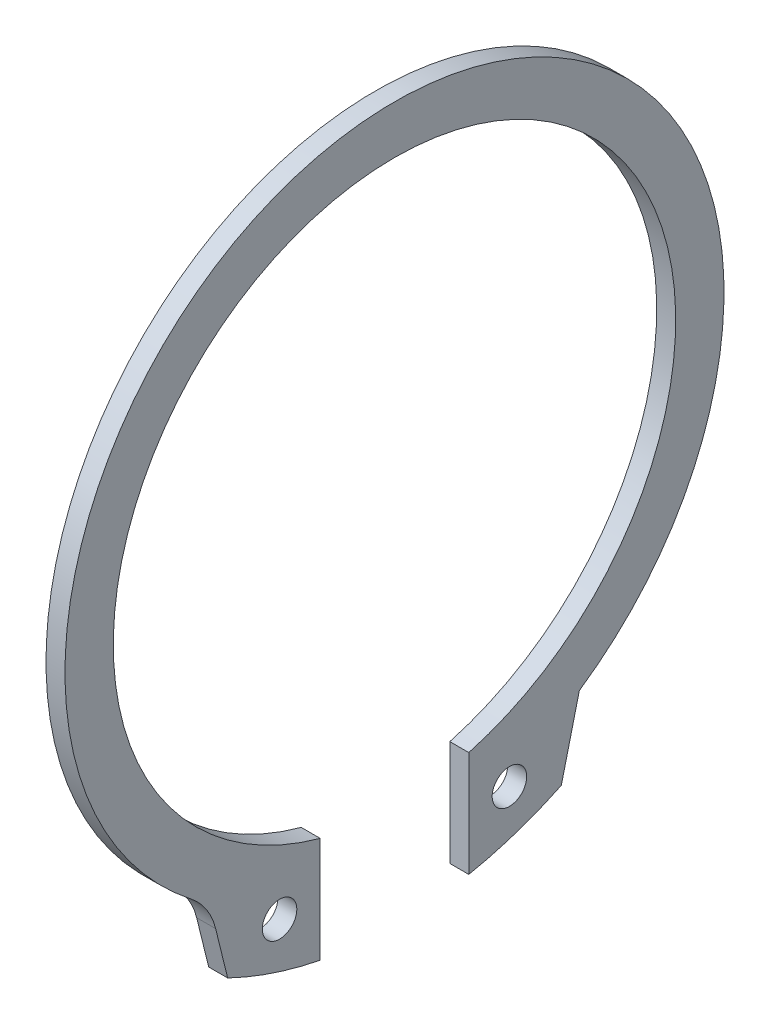
ISO-10303-21;
HEADER;
FILE_DESCRIPTION(('STEP AP214'),'2;1');
FILE_NAME('part.step','',(''),(''),'','','');
FILE_SCHEMA(('AUTOMOTIVE_DESIGN { 1 0 10303 214 1 1 1 1 }'));
ENDSEC;
DATA;
#1=APPLICATION_CONTEXT('core data for automotive mechanical design processes');
#2=APPLICATION_PROTOCOL_DEFINITION('international standard','automotive_design',2000,#1);
#3=PRODUCT_CONTEXT('',#1,'mechanical');
#4=PRODUCT('Part','Part','',(#3));
#5=PRODUCT_RELATED_PRODUCT_CATEGORY('part','',(#4));
#6=PRODUCT_DEFINITION_FORMATION('','',#4);
#7=PRODUCT_DEFINITION_CONTEXT('part definition',#1,'design');
#8=PRODUCT_DEFINITION('design','',#6,#7);
#9=PRODUCT_DEFINITION_SHAPE('','',#8);
#10=(LENGTH_UNIT() NAMED_UNIT(*) SI_UNIT(.MILLI.,.METRE.));
#11=(NAMED_UNIT(*) PLANE_ANGLE_UNIT() SI_UNIT($,.RADIAN.));
#12=(NAMED_UNIT(*) SI_UNIT($,.STERADIAN.) SOLID_ANGLE_UNIT());
#13=UNCERTAINTY_MEASURE_WITH_UNIT(LENGTH_MEASURE(1.E-05),#10,'distance_accuracy_value','');
#14=(GEOMETRIC_REPRESENTATION_CONTEXT(3) GLOBAL_UNCERTAINTY_ASSIGNED_CONTEXT((#13)) GLOBAL_UNIT_ASSIGNED_CONTEXT((#10,
#11,#12)) REPRESENTATION_CONTEXT('',''));
#15=CARTESIAN_POINT('',(0.,0.,0.));
#16=DIRECTION('',(0.,0.,1.));
#17=DIRECTION('',(1.,0.,0.));
#18=AXIS2_PLACEMENT_3D('',#15,#16,#17);
#19=CARTESIAN_POINT('',(2.75,-45.4519677145111,35.6255684990295));
#20=DIRECTION('',(-1.,0.,0.));
#21=DIRECTION('',(0.,0.,1.));
#22=AXIS2_PLACEMENT_3D('',#19,#20,#21);
#23=CYLINDRICAL_SURFACE('',#22,10.);
#24=CARTESIAN_POINT('',(0.,-45.4519677145111,35.6255684990295));
#25=DIRECTION('',(1.,0.,0.));
#26=DIRECTION('',(0.,0.,-1.));
#27=AXIS2_PLACEMENT_3D('',#24,#25,#26);
#28=CIRCLE('',#27,10.);
#29=CARTESIAN_POINT('',(0.,-43.0571234239449,25.916566448152));
#30=VERTEX_POINT('',#29);
#31=CARTESIAN_POINT('',(0.,-37.5814971145957,29.456638888808));
#32=VERTEX_POINT('',#31);
#33=EDGE_CURVE('E146',#30,#32,#28,.T.);
#34=ORIENTED_EDGE('',*,*,#33,.F.);
#35=DIRECTION('',(-1.,0.,0.));
#36=VECTOR('',#35,1.);
#37=CARTESIAN_POINT('',(2.75,-43.0571234239449,25.916566448152));
#38=LINE('',#37,#36);
#39=CARTESIAN_POINT('',(2.75,-43.0571234239449,25.916566448152));
#40=VERTEX_POINT('',#39);
#41=EDGE_CURVE('E11',#40,#30,#38,.T.);
#42=ORIENTED_EDGE('',*,*,#41,.F.);
#43=CARTESIAN_POINT('',(2.75,-45.4519677145111,35.6255684990295));
#44=DIRECTION('',(1.,0.,0.));
#45=DIRECTION('',(0.,0.,-1.));
#46=AXIS2_PLACEMENT_3D('',#43,#44,#45);
#47=CIRCLE('',#46,10.);
#48=CARTESIAN_POINT('',(2.75,-37.5814971145957,29.456638888808));
#49=VERTEX_POINT('',#48);
#50=EDGE_CURVE('E174',#40,#49,#47,.T.);
#51=ORIENTED_EDGE('',*,*,#50,.T.);
#52=DIRECTION('',(-1.,0.,0.));
#53=VECTOR('',#52,1.);
#54=CARTESIAN_POINT('',(2.75,-37.5814971145957,29.456638888808));
#55=LINE('',#54,#53);
#56=EDGE_CURVE('E92',#49,#32,#55,.T.);
#57=ORIENTED_EDGE('',*,*,#56,.T.);
#58=EDGE_LOOP('',(#34,#42,#51,#57));
#59=FACE_BOUND('',#58,.T.);
#60=ADVANCED_FACE('F39',(#59),#23,.F.);
#61=CARTESIAN_POINT('',(2.75,-8.4954491545256,34.4416267852282));
#62=DIRECTION('',(0.,-0.239484429056616,0.970900205087746));
#63=DIRECTION('',(0.,-0.970900205087746,-0.239484429056616));
#64=AXIS2_PLACEMENT_3D('',#61,#62,#63);
#65=PLANE('',#64);
#66=DIRECTION('',(0.,0.970900205087746,0.239484429056616));
#67=VECTOR('',#66,1.);
#68=CARTESIAN_POINT('',(0.,-8.4954491545256,34.4416267852282));
#69=LINE('',#68,#67);
#70=CARTESIAN_POINT('',(0.,-50.1229604559461,24.1736911881113));
#71=VERTEX_POINT('',#70);
#72=EDGE_CURVE('E149',#71,#30,#69,.T.);
#73=ORIENTED_EDGE('',*,*,#72,.F.);
#74=DIRECTION('',(-1.,0.,0.));
#75=VECTOR('',#74,1.);
#76=CARTESIAN_POINT('',(2.75,-50.1229604559461,24.1736911881113));
#77=LINE('',#76,#75);
#78=CARTESIAN_POINT('',(2.75,-50.1229604559461,24.1736911881113));
#79=VERTEX_POINT('',#78);
#80=EDGE_CURVE('E47',#79,#71,#77,.T.);
#81=ORIENTED_EDGE('',*,*,#80,.F.);
#82=DIRECTION('',(0.,0.970900205087746,0.239484429056616));
#83=VECTOR('',#82,1.);
#84=CARTESIAN_POINT('',(2.75,-8.4954491545256,34.4416267852282));
#85=LINE('',#84,#83);
#86=EDGE_CURVE('E198',#79,#40,#85,.T.);
#87=ORIENTED_EDGE('',*,*,#86,.T.);
#88=ORIENTED_EDGE('',*,*,#41,.T.);
#89=EDGE_LOOP('',(#73,#81,#87,#88));
#90=FACE_BOUND('',#89,.T.);
#91=ADVANCED_FACE('F197',(#90),#65,.T.);
#92=CARTESIAN_POINT('',(2.75,0.,0.));
#93=DIRECTION('',(-1.,0.,0.));
#94=DIRECTION('',(0.,0.,1.));
#95=AXIS2_PLACEMENT_3D('',#92,#93,#94);
#96=CYLINDRICAL_SURFACE('',#95,55.647807778263);
#97=CARTESIAN_POINT('',(0.,0.,0.));
#98=DIRECTION('',(1.,0.,0.));
#99=DIRECTION('',(0.,0.,-1.));
#100=AXIS2_PLACEMENT_3D('',#97,#98,#99);
#101=CIRCLE('',#100,55.647807778263);
#102=CARTESIAN_POINT('',(0.,-54.5963916751325,10.7662679969443));
#103=VERTEX_POINT('',#102);
#104=EDGE_CURVE('E152',#71,#103,#101,.T.);
#105=ORIENTED_EDGE('',*,*,#104,.T.);
#106=DIRECTION('',(-1.,0.,0.));
#107=VECTOR('',#106,1.);
#108=CARTESIAN_POINT('',(2.75,-54.5963916751325,10.7662679969443));
#109=LINE('',#108,#107);
#110=CARTESIAN_POINT('',(2.75,-54.5963916751325,10.7662679969443));
#111=VERTEX_POINT('',#110);
#112=EDGE_CURVE('E182',#111,#103,#109,.T.);
#113=ORIENTED_EDGE('',*,*,#112,.F.);
#114=CARTESIAN_POINT('',(2.75,0.,0.));
#115=DIRECTION('',(1.,0.,0.));
#116=DIRECTION('',(0.,0.,-1.));
#117=AXIS2_PLACEMENT_3D('',#114,#115,#116);
#118=CIRCLE('',#117,55.647807778263);
#119=EDGE_CURVE('E188',#79,#111,#118,.T.);
#120=ORIENTED_EDGE('',*,*,#119,.F.);
#121=ORIENTED_EDGE('',*,*,#80,.T.);
#122=EDGE_LOOP('',(#105,#113,#120,#121));
#123=FACE_BOUND('',#122,.T.);
#124=ADVANCED_FACE('F186',(#123),#96,.T.);
#125=CARTESIAN_POINT('',(2.75,0.,10.7662679969443));
#126=DIRECTION('',(0.,0.,-1.));
#127=DIRECTION('',(0.,1.,0.));
#128=AXIS2_PLACEMENT_3D('',#125,#126,#127);
#129=PLANE('',#128);
#130=DIRECTION('',(0.,-1.,0.));
#131=VECTOR('',#130,1.);
#132=CARTESIAN_POINT('',(0.,0.,10.7662679969443));
#133=LINE('',#132,#131);
#134=CARTESIAN_POINT('',(0.,-39.3020352325166,10.7662679969443));
#135=VERTEX_POINT('',#134);
#136=EDGE_CURVE('E155',#135,#103,#133,.T.);
#137=ORIENTED_EDGE('',*,*,#136,.F.);
#138=DIRECTION('',(-1.,0.,0.));
#139=VECTOR('',#138,1.);
#140=CARTESIAN_POINT('',(2.75,-39.3020352325166,10.7662679969443));
#141=LINE('',#140,#139);
#142=CARTESIAN_POINT('',(2.75,-39.3020352325166,10.7662679969443));
#143=VERTEX_POINT('',#142);
#144=EDGE_CURVE('E180',#143,#135,#141,.T.);
#145=ORIENTED_EDGE('',*,*,#144,.F.);
#146=DIRECTION('',(0.,-1.,0.));
#147=VECTOR('',#146,1.);
#148=CARTESIAN_POINT('',(2.75,0.,10.7662679969443));
#149=LINE('',#148,#147);
#150=EDGE_CURVE('E206',#143,#111,#149,.T.);
#151=ORIENTED_EDGE('',*,*,#150,.T.);
#152=ORIENTED_EDGE('',*,*,#112,.T.);
#153=EDGE_LOOP('',(#137,#145,#151,#152));
#154=FACE_BOUND('',#153,.T.);
#155=ADVANCED_FACE('F214',(#154),#129,.T.);
#156=CARTESIAN_POINT('',(2.75,0.,0.));
#157=DIRECTION('',(-1.,0.,0.));
#158=DIRECTION('',(0.,0.,1.));
#159=AXIS2_PLACEMENT_3D('',#156,#157,#158);
#160=CYLINDRICAL_SURFACE('',#159,40.75);
#161=CARTESIAN_POINT('',(0.,0.,0.));
#162=DIRECTION('',(1.,0.,0.));
#163=DIRECTION('',(0.,0.,-1.));
#164=AXIS2_PLACEMENT_3D('',#161,#162,#163);
#165=CIRCLE('',#164,40.75);
#166=CARTESIAN_POINT('',(0.,-39.3020352325166,-10.7662679969443));
#167=VERTEX_POINT('',#166);
#168=EDGE_CURVE('E158',#167,#135,#165,.T.);
#169=ORIENTED_EDGE('',*,*,#168,.F.);
#170=DIRECTION('',(-1.,0.,0.));
#171=VECTOR('',#170,1.);
#172=CARTESIAN_POINT('',(2.75,-39.3020352325166,-10.7662679969443));
#173=LINE('',#172,#171);
#174=CARTESIAN_POINT('',(2.75,-39.3020352325166,-10.7662679969443));
#175=VERTEX_POINT('',#174);
#176=EDGE_CURVE('E178',#175,#167,#173,.T.);
#177=ORIENTED_EDGE('',*,*,#176,.F.);
#178=CARTESIAN_POINT('',(2.75,0.,0.));
#179=DIRECTION('',(1.,0.,0.));
#180=DIRECTION('',(0.,0.,-1.));
#181=AXIS2_PLACEMENT_3D('',#178,#179,#180);
#182=CIRCLE('',#181,40.75);
#183=EDGE_CURVE('E135',#175,#143,#182,.T.);
#184=ORIENTED_EDGE('',*,*,#183,.T.);
#185=ORIENTED_EDGE('',*,*,#144,.T.);
#186=EDGE_LOOP('',(#169,#177,#184,#185));
#187=FACE_BOUND('',#186,.T.);
#188=ADVANCED_FACE('F211',(#187),#160,.F.);
#189=CARTESIAN_POINT('',(2.75,0.,-10.7662679969443));
#190=DIRECTION('',(0.,0.,-1.));
#191=DIRECTION('',(0.,1.,0.));
#192=AXIS2_PLACEMENT_3D('',#189,#190,#191);
#193=PLANE('',#192);
#194=DIRECTION('',(0.,-1.,0.));
#195=VECTOR('',#194,1.);
#196=CARTESIAN_POINT('',(0.,0.,-10.7662679969443));
#197=LINE('',#196,#195);
#198=CARTESIAN_POINT('',(0.,-54.5963916751325,-10.7662679969443));
#199=VERTEX_POINT('',#198);
#200=EDGE_CURVE('E161',#167,#199,#197,.T.);
#201=ORIENTED_EDGE('',*,*,#200,.T.);
#202=DIRECTION('',(-1.,0.,0.));
#203=VECTOR('',#202,1.);
#204=CARTESIAN_POINT('',(2.75,-54.5963916751325,-10.7662679969443));
#205=LINE('',#204,#203);
#206=CARTESIAN_POINT('',(2.75,-54.5963916751325,-10.7662679969443));
#207=VERTEX_POINT('',#206);
#208=EDGE_CURVE('E122',#207,#199,#205,.T.);
#209=ORIENTED_EDGE('',*,*,#208,.F.);
#210=DIRECTION('',(0.,-1.,0.));
#211=VECTOR('',#210,1.);
#212=CARTESIAN_POINT('',(2.75,0.,-10.7662679969443));
#213=LINE('',#212,#211);
#214=EDGE_CURVE('E132',#175,#207,#213,.T.);
#215=ORIENTED_EDGE('',*,*,#214,.F.);
#216=ORIENTED_EDGE('',*,*,#176,.T.);
#217=EDGE_LOOP('',(#201,#209,#215,#216));
#218=FACE_BOUND('',#217,.T.);
#219=ADVANCED_FACE('F217',(#218),#193,.F.);
#220=CARTESIAN_POINT('',(2.75,0.,0.));
#221=DIRECTION('',(-1.,0.,0.));
#222=DIRECTION('',(0.,0.,1.));
#223=AXIS2_PLACEMENT_3D('',#220,#221,#222);
#224=CYLINDRICAL_SURFACE('',#223,55.647807778263);
#225=CARTESIAN_POINT('',(0.,0.,0.));
#226=DIRECTION('',(1.,0.,0.));
#227=DIRECTION('',(0.,0.,-1.));
#228=AXIS2_PLACEMENT_3D('',#225,#226,#227);
#229=CIRCLE('',#228,55.647807778263);
#230=CARTESIAN_POINT('',(0.,-50.1229604559461,-24.1736911881113));
#231=VERTEX_POINT('',#230);
#232=EDGE_CURVE('E121',#231,#199,#229,.F.);
#233=ORIENTED_EDGE('',*,*,#232,.F.);
#234=DIRECTION('',(-1.,0.,0.));
#235=VECTOR('',#234,1.);
#236=CARTESIAN_POINT('',(2.75,-50.1229604559461,-24.1736911881113));
#237=LINE('',#236,#235);
#238=CARTESIAN_POINT('',(2.75,-50.1229604559461,-24.1736911881113));
#239=VERTEX_POINT('',#238);
#240=EDGE_CURVE('E115',#239,#231,#237,.T.);
#241=ORIENTED_EDGE('',*,*,#240,.F.);
#242=CARTESIAN_POINT('',(2.75,0.,0.));
#243=DIRECTION('',(1.,0.,0.));
#244=DIRECTION('',(0.,0.,-1.));
#245=AXIS2_PLACEMENT_3D('',#242,#243,#244);
#246=CIRCLE('',#245,55.647807778263);
#247=EDGE_CURVE('E119',#239,#207,#246,.F.);
#248=ORIENTED_EDGE('',*,*,#247,.T.);
#249=ORIENTED_EDGE('',*,*,#208,.T.);
#250=EDGE_LOOP('',(#233,#241,#248,#249));
#251=FACE_BOUND('',#250,.T.);
#252=ADVANCED_FACE('F117',(#251),#224,.T.);
#253=CARTESIAN_POINT('',(2.75,-8.49544915452554,-34.4416267852281));
#254=DIRECTION('',(0.,0.239484429056615,0.970900205087746));
#255=DIRECTION('',(0.,-0.970900205087746,0.239484429056615));
#256=AXIS2_PLACEMENT_3D('',#253,#254,#255);
#257=PLANE('',#256);
#258=DIRECTION('',(0.,0.970900205087746,-0.239484429056615));
#259=VECTOR('',#258,1.);
#260=CARTESIAN_POINT('',(0.,-8.49544915452554,-34.4416267852281));
#261=LINE('',#260,#259);
#262=CARTESIAN_POINT('',(0.,-39.5288004821451,-26.7868705235003));
#263=VERTEX_POINT('',#262);
#264=EDGE_CURVE('E85',#231,#263,#261,.T.);
#265=ORIENTED_EDGE('',*,*,#264,.T.);
#266=DIRECTION('',(-1.,0.,0.));
#267=VECTOR('',#266,1.);
#268=CARTESIAN_POINT('',(2.75,-39.5288004821451,-26.7868705235003));
#269=LINE('',#268,#267);
#270=CARTESIAN_POINT('',(2.75,-39.5288004821451,-26.7868705235003));
#271=VERTEX_POINT('',#270);
#272=EDGE_CURVE('E123',#271,#263,#269,.T.);
#273=ORIENTED_EDGE('',*,*,#272,.F.);
#274=DIRECTION('',(0.,0.970900205087746,-0.239484429056615));
#275=VECTOR('',#274,1.);
#276=CARTESIAN_POINT('',(2.75,-8.49544915452554,-34.4416267852281));
#277=LINE('',#276,#275);
#278=EDGE_CURVE('E125',#239,#271,#277,.T.);
#279=ORIENTED_EDGE('',*,*,#278,.F.);
#280=ORIENTED_EDGE('',*,*,#240,.T.);
#281=EDGE_LOOP('',(#265,#273,#279,#280));
#282=FACE_BOUND('',#281,.T.);
#283=ADVANCED_FACE('F126',(#282),#257,.F.);
#284=CARTESIAN_POINT('',(2.75,-46.5046247805078,16.6535775260698));
#285=DIRECTION('',(-1.,0.,0.));
#286=DIRECTION('',(0.,0.,1.));
#287=AXIS2_PLACEMENT_3D('',#284,#285,#286);
#288=CYLINDRICAL_SURFACE('',#287,2.5);
#289=CARTESIAN_POINT('',(2.75,-46.5046247805078,16.6535775260698));
#290=DIRECTION('',(1.,0.,0.));
#291=DIRECTION('',(0.,0.,-1.));
#292=AXIS2_PLACEMENT_3D('',#289,#290,#291);
#293=CIRCLE('',#292,2.5);
#294=CARTESIAN_POINT('',(2.75,-46.5046247805078,14.1535775260698));
#295=VERTEX_POINT('',#294);
#296=EDGE_CURVE('E140',#295,#295,#293,.T.);
#297=ORIENTED_EDGE('',*,*,#296,.T.);
#298=EDGE_LOOP('',(#297));
#299=FACE_BOUND('',#298,.T.);
#300=CARTESIAN_POINT('',(0.,-46.5046247805078,16.6535775260698));
#301=DIRECTION('',(1.,0.,0.));
#302=DIRECTION('',(0.,0.,-1.));
#303=AXIS2_PLACEMENT_3D('',#300,#301,#302);
#304=CIRCLE('',#303,2.5);
#305=CARTESIAN_POINT('',(0.,-46.5046247805078,14.1535775260698));
#306=VERTEX_POINT('',#305);
#307=EDGE_CURVE('E168',#306,#306,#304,.T.);
#308=ORIENTED_EDGE('',*,*,#307,.F.);
#309=EDGE_LOOP('',(#308));
#310=FACE_BOUND('',#309,.T.);
#311=ADVANCED_FACE('F263',(#299,#310),#288,.F.);
#312=CARTESIAN_POINT('',(2.75,0.,0.));
#313=DIRECTION('',(-1.,0.,0.));
#314=DIRECTION('',(0.,0.,1.));
#315=AXIS2_PLACEMENT_3D('',#312,#313,#314);
#316=CYLINDRICAL_SURFACE('',#315,47.75);
#317=CARTESIAN_POINT('',(0.,0.,0.));
#318=DIRECTION('',(1.,0.,0.));
#319=DIRECTION('',(0.,0.,-1.));
#320=AXIS2_PLACEMENT_3D('',#317,#318,#319);
#321=CIRCLE('',#320,47.75);
#322=EDGE_CURVE('E166',#263,#32,#321,.T.);
#323=ORIENTED_EDGE('',*,*,#322,.T.);
#324=ORIENTED_EDGE('',*,*,#56,.F.);
#325=CARTESIAN_POINT('',(2.75,0.,0.));
#326=DIRECTION('',(1.,0.,0.));
#327=DIRECTION('',(0.,0.,-1.));
#328=AXIS2_PLACEMENT_3D('',#325,#326,#327);
#329=CIRCLE('',#328,47.75);
#330=EDGE_CURVE('E55',#271,#49,#329,.T.);
#331=ORIENTED_EDGE('',*,*,#330,.F.);
#332=ORIENTED_EDGE('',*,*,#272,.T.);
#333=EDGE_LOOP('',(#323,#324,#331,#332));
#334=FACE_BOUND('',#333,.T.);
#335=ADVANCED_FACE('F201',(#334),#316,.T.);
#336=CARTESIAN_POINT('',(2.75,-46.5046247805078,-16.6535775260698));
#337=DIRECTION('',(-1.,0.,0.));
#338=DIRECTION('',(0.,0.,1.));
#339=AXIS2_PLACEMENT_3D('',#336,#337,#338);
#340=CYLINDRICAL_SURFACE('',#339,2.5);
#341=CARTESIAN_POINT('',(2.75,-46.5046247805078,-16.6535775260698));
#342=DIRECTION('',(1.,0.,0.));
#343=DIRECTION('',(0.,0.,-1.));
#344=AXIS2_PLACEMENT_3D('',#341,#342,#343);
#345=CIRCLE('',#344,2.5);
#346=CARTESIAN_POINT('',(2.75,-46.5046247805078,-19.1535775260698));
#347=VERTEX_POINT('',#346);
#348=EDGE_CURVE('E143',#347,#347,#345,.F.);
#349=ORIENTED_EDGE('',*,*,#348,.F.);
#350=EDGE_LOOP('',(#349));
#351=FACE_BOUND('',#350,.T.);
#352=CARTESIAN_POINT('',(0.,-46.5046247805078,-16.6535775260698));
#353=DIRECTION('',(1.,0.,0.));
#354=DIRECTION('',(0.,0.,-1.));
#355=AXIS2_PLACEMENT_3D('',#352,#353,#354);
#356=CIRCLE('',#355,2.5);
#357=CARTESIAN_POINT('',(0.,-46.5046247805078,-19.1535775260698));
#358=VERTEX_POINT('',#357);
#359=EDGE_CURVE('E171',#358,#358,#356,.F.);
#360=ORIENTED_EDGE('',*,*,#359,.T.);
#361=EDGE_LOOP('',(#360));
#362=FACE_BOUND('',#361,.T.);
#363=ADVANCED_FACE('F281',(#351,#362),#340,.F.);
#364=CARTESIAN_POINT('',(2.75,0.,0.));
#365=DIRECTION('',(1.,0.,0.));
#366=DIRECTION('',(0.,0.,-1.));
#367=AXIS2_PLACEMENT_3D('',#364,#365,#366);
#368=PLANE('',#367);
#369=ORIENTED_EDGE('',*,*,#50,.F.);
#370=ORIENTED_EDGE('',*,*,#86,.F.);
#371=ORIENTED_EDGE('',*,*,#119,.T.);
#372=ORIENTED_EDGE('',*,*,#150,.F.);
#373=ORIENTED_EDGE('',*,*,#183,.F.);
#374=ORIENTED_EDGE('',*,*,#214,.T.);
#375=ORIENTED_EDGE('',*,*,#247,.F.);
#376=ORIENTED_EDGE('',*,*,#278,.T.);
#377=ORIENTED_EDGE('',*,*,#330,.T.);
#378=EDGE_LOOP('',(#369,#370,#371,#372,#373,#374,#375,#376,#377));
#379=FACE_BOUND('',#378,.T.);
#380=ORIENTED_EDGE('',*,*,#296,.F.);
#381=EDGE_LOOP('',(#380));
#382=FACE_BOUND('',#381,.T.);
#383=ORIENTED_EDGE('',*,*,#348,.T.);
#384=EDGE_LOOP('',(#383));
#385=FACE_BOUND('',#384,.T.);
#386=ADVANCED_FACE('F128',(#379,#382,#385),#368,.T.);
#387=CARTESIAN_POINT('',(0.,0.,0.));
#388=DIRECTION('',(1.,0.,0.));
#389=DIRECTION('',(0.,0.,-1.));
#390=AXIS2_PLACEMENT_3D('',#387,#388,#389);
#391=PLANE('',#390);
#392=ORIENTED_EDGE('',*,*,#33,.T.);
#393=ORIENTED_EDGE('',*,*,#322,.F.);
#394=ORIENTED_EDGE('',*,*,#264,.F.);
#395=ORIENTED_EDGE('',*,*,#232,.T.);
#396=ORIENTED_EDGE('',*,*,#200,.F.);
#397=ORIENTED_EDGE('',*,*,#168,.T.);
#398=ORIENTED_EDGE('',*,*,#136,.T.);
#399=ORIENTED_EDGE('',*,*,#104,.F.);
#400=ORIENTED_EDGE('',*,*,#72,.T.);
#401=EDGE_LOOP('',(#392,#393,#394,#395,#396,#397,#398,#399,#400));
#402=FACE_BOUND('',#401,.T.);
#403=ORIENTED_EDGE('',*,*,#307,.T.);
#404=EDGE_LOOP('',(#403));
#405=FACE_BOUND('',#404,.T.);
#406=ORIENTED_EDGE('',*,*,#359,.F.);
#407=EDGE_LOOP('',(#406));
#408=FACE_BOUND('',#407,.T.);
#409=ADVANCED_FACE('F194',(#402,#405,#408),#391,.F.);
#410=CLOSED_SHELL('',(#60,#91,#124,#155,#188,#219,#252,#283,#311,#335,#363,#386,#409));
#411=MANIFOLD_SOLID_BREP('B2',#410);
#412=ADVANCED_BREP_SHAPE_REPRESENTATION('',(#18,#411),#14);
#413=SHAPE_DEFINITION_REPRESENTATION(#9,#412);
ENDSEC;
END-ISO-10303-21;
